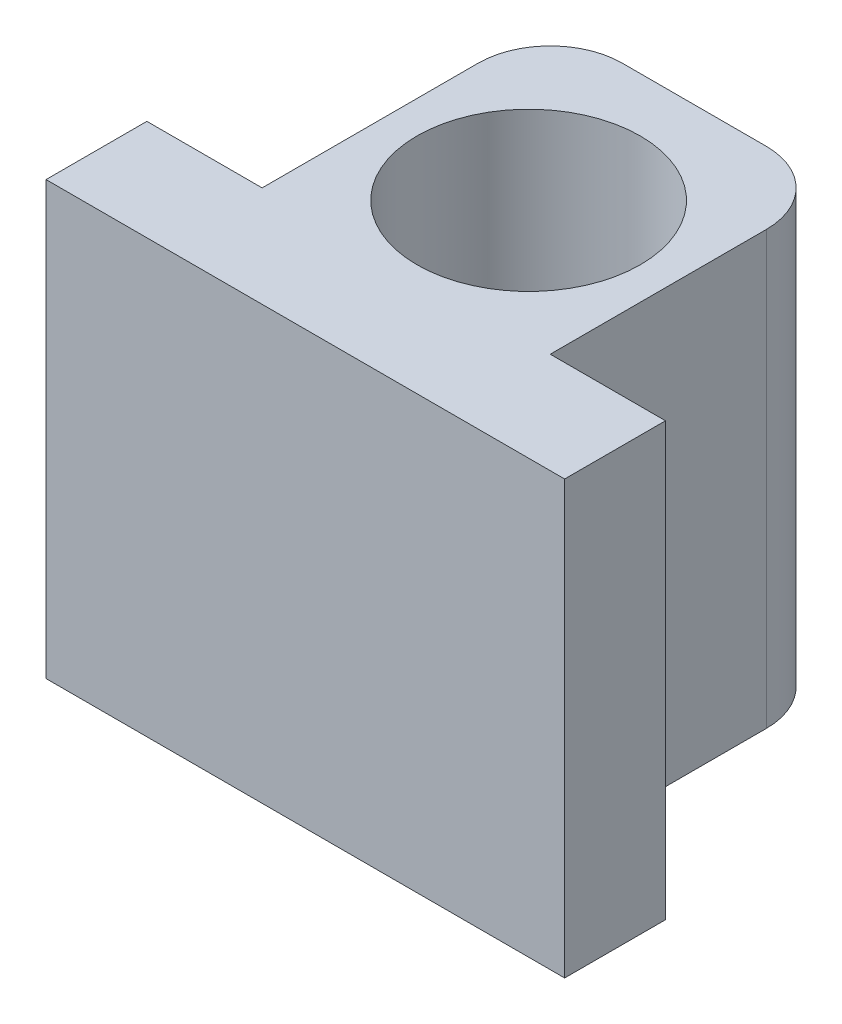
ISO-10303-21;
HEADER;
FILE_DESCRIPTION(('STEP AP214'),'2;1');
FILE_NAME('part.step','',(''),(''),'','','');
FILE_SCHEMA(('AUTOMOTIVE_DESIGN { 1 0 10303 214 1 1 1 1 }'));
ENDSEC;
DATA;
#1=APPLICATION_CONTEXT('core data for automotive mechanical design processes');
#2=APPLICATION_PROTOCOL_DEFINITION('international standard','automotive_design',2000,#1);
#3=PRODUCT_CONTEXT('',#1,'mechanical');
#4=PRODUCT('Part','Part','',(#3));
#5=PRODUCT_RELATED_PRODUCT_CATEGORY('part','',(#4));
#6=PRODUCT_DEFINITION_FORMATION('','',#4);
#7=PRODUCT_DEFINITION_CONTEXT('part definition',#1,'design');
#8=PRODUCT_DEFINITION('design','',#6,#7);
#9=PRODUCT_DEFINITION_SHAPE('','',#8);
#10=(LENGTH_UNIT() NAMED_UNIT(*) SI_UNIT(.MILLI.,.METRE.));
#11=(NAMED_UNIT(*) PLANE_ANGLE_UNIT() SI_UNIT($,.RADIAN.));
#12=(NAMED_UNIT(*) SI_UNIT($,.STERADIAN.) SOLID_ANGLE_UNIT());
#13=UNCERTAINTY_MEASURE_WITH_UNIT(LENGTH_MEASURE(1.E-05),#10,'distance_accuracy_value','');
#14=(GEOMETRIC_REPRESENTATION_CONTEXT(3) GLOBAL_UNCERTAINTY_ASSIGNED_CONTEXT((#13)) GLOBAL_UNIT_ASSIGNED_CONTEXT((#10,
#11,#12)) REPRESENTATION_CONTEXT('',''));
#15=CARTESIAN_POINT('',(0.,0.,0.));
#16=DIRECTION('',(0.,0.,1.));
#17=DIRECTION('',(1.,0.,0.));
#18=AXIS2_PLACEMENT_3D('',#15,#16,#17);
#19=CARTESIAN_POINT('',(-14.8639053254438,30.,3.));
#20=DIRECTION('',(1.,0.,0.));
#21=DIRECTION('',(0.,0.,-1.));
#22=AXIS2_PLACEMENT_3D('',#19,#20,#21);
#23=PLANE('',#22);
#24=DIRECTION('',(0.,0.,1.));
#25=VECTOR('',#24,1.);
#26=CARTESIAN_POINT('',(-14.8639053254438,0.,3.));
#27=LINE('',#26,#25);
#28=CARTESIAN_POINT('',(-14.8639053254438,0.,0.));
#29=VERTEX_POINT('',#28);
#30=CARTESIAN_POINT('',(-14.8639053254438,0.,7.));
#31=VERTEX_POINT('',#30);
#32=EDGE_CURVE('E125',#29,#31,#27,.T.);
#33=ORIENTED_EDGE('',*,*,#32,.T.);
#34=DIRECTION('',(0.,-1.,0.));
#35=VECTOR('',#34,1.);
#36=CARTESIAN_POINT('',(-14.8639053254438,30.,7.));
#37=LINE('',#36,#35);
#38=CARTESIAN_POINT('',(-14.8639053254438,30.,7.));
#39=VERTEX_POINT('',#38);
#40=EDGE_CURVE('E129',#39,#31,#37,.T.);
#41=ORIENTED_EDGE('',*,*,#40,.F.);
#42=DIRECTION('',(0.,0.,1.));
#43=VECTOR('',#42,1.);
#44=CARTESIAN_POINT('',(-14.8639053254438,30.,3.));
#45=LINE('',#44,#43);
#46=CARTESIAN_POINT('',(-14.8639053254438,30.,0.));
#47=VERTEX_POINT('',#46);
#48=EDGE_CURVE('E167',#47,#39,#45,.T.);
#49=ORIENTED_EDGE('',*,*,#48,.F.);
#50=DIRECTION('',(0.,-1.,0.));
#51=VECTOR('',#50,1.);
#52=CARTESIAN_POINT('',(-14.8639053254438,30.,0.));
#53=LINE('',#52,#51);
#54=EDGE_CURVE('E131',#47,#29,#53,.T.);
#55=ORIENTED_EDGE('',*,*,#54,.T.);
#56=EDGE_LOOP('',(#33,#41,#49,#55));
#57=FACE_BOUND('',#56,.T.);
#58=ADVANCED_FACE('F43',(#57),#23,.F.);
#59=CARTESIAN_POINT('',(21.1360946745562,30.,0.));
#60=DIRECTION('',(-1.,0.,0.));
#61=DIRECTION('',(0.,0.,1.));
#62=AXIS2_PLACEMENT_3D('',#59,#60,#61);
#63=PLANE('',#62);
#64=DIRECTION('',(0.,0.,-1.));
#65=VECTOR('',#64,1.);
#66=CARTESIAN_POINT('',(21.1360946745562,0.,0.));
#67=LINE('',#66,#65);
#68=CARTESIAN_POINT('',(21.1360946745562,0.,7.));
#69=VERTEX_POINT('',#68);
#70=CARTESIAN_POINT('',(21.1360946745562,0.,0.));
#71=VERTEX_POINT('',#70);
#72=EDGE_CURVE('E135',#69,#71,#67,.T.);
#73=ORIENTED_EDGE('',*,*,#72,.T.);
#74=DIRECTION('',(0.,-1.,0.));
#75=VECTOR('',#74,1.);
#76=CARTESIAN_POINT('',(21.1360946745562,30.,0.));
#77=LINE('',#76,#75);
#78=CARTESIAN_POINT('',(21.1360946745562,30.,0.));
#79=VERTEX_POINT('',#78);
#80=EDGE_CURVE('E216',#79,#71,#77,.T.);
#81=ORIENTED_EDGE('',*,*,#80,.F.);
#82=DIRECTION('',(0.,0.,-1.));
#83=VECTOR('',#82,1.);
#84=CARTESIAN_POINT('',(21.1360946745562,30.,0.));
#85=LINE('',#84,#83);
#86=CARTESIAN_POINT('',(21.1360946745562,30.,7.));
#87=VERTEX_POINT('',#86);
#88=EDGE_CURVE('E170',#87,#79,#85,.T.);
#89=ORIENTED_EDGE('',*,*,#88,.F.);
#90=DIRECTION('',(0.,1.,0.));
#91=VECTOR('',#90,1.);
#92=CARTESIAN_POINT('',(21.1360946745562,30.,7.));
#93=LINE('',#92,#91);
#94=EDGE_CURVE('E147',#69,#87,#93,.T.);
#95=ORIENTED_EDGE('',*,*,#94,.F.);
#96=EDGE_LOOP('',(#73,#81,#89,#95));
#97=FACE_BOUND('',#96,.T.);
#98=ADVANCED_FACE('F254',(#97),#63,.F.);
#99=CARTESIAN_POINT('',(13.1360946745562,30.,0.));
#100=DIRECTION('',(0.,0.,1.));
#101=DIRECTION('',(1.,0.,0.));
#102=AXIS2_PLACEMENT_3D('',#99,#100,#101);
#103=PLANE('',#102);
#104=DIRECTION('',(-1.,0.,0.));
#105=VECTOR('',#104,1.);
#106=CARTESIAN_POINT('',(13.1360946745562,0.,0.));
#107=LINE('',#106,#105);
#108=CARTESIAN_POINT('',(13.1360946745562,0.,0.));
#109=VERTEX_POINT('',#108);
#110=EDGE_CURVE('E191',#71,#109,#107,.T.);
#111=ORIENTED_EDGE('',*,*,#110,.T.);
#112=DIRECTION('',(0.,-1.,0.));
#113=VECTOR('',#112,1.);
#114=CARTESIAN_POINT('',(13.1360946745562,30.,0.));
#115=LINE('',#114,#113);
#116=CARTESIAN_POINT('',(13.1360946745562,30.,0.));
#117=VERTEX_POINT('',#116);
#118=EDGE_CURVE('E212',#117,#109,#115,.T.);
#119=ORIENTED_EDGE('',*,*,#118,.F.);
#120=DIRECTION('',(-1.,0.,0.));
#121=VECTOR('',#120,1.);
#122=CARTESIAN_POINT('',(13.1360946745562,30.,0.));
#123=LINE('',#122,#121);
#124=EDGE_CURVE('E174',#79,#117,#123,.T.);
#125=ORIENTED_EDGE('',*,*,#124,.F.);
#126=ORIENTED_EDGE('',*,*,#80,.T.);
#127=EDGE_LOOP('',(#111,#119,#125,#126));
#128=FACE_BOUND('',#127,.T.);
#129=ADVANCED_FACE('F251',(#128),#103,.F.);
#130=CARTESIAN_POINT('',(13.1360946745562,30.,-20.));
#131=DIRECTION('',(-1.,0.,0.));
#132=DIRECTION('',(0.,0.,1.));
#133=AXIS2_PLACEMENT_3D('',#130,#131,#132);
#134=PLANE('',#133);
#135=DIRECTION('',(0.,0.,-1.));
#136=VECTOR('',#135,1.);
#137=CARTESIAN_POINT('',(13.1360946745562,0.,-20.));
#138=LINE('',#137,#136);
#139=CARTESIAN_POINT('',(13.1360946745562,0.,-15.));
#140=VERTEX_POINT('',#139);
#141=EDGE_CURVE('E194',#109,#140,#138,.T.);
#142=ORIENTED_EDGE('',*,*,#141,.T.);
#143=DIRECTION('',(0.,-1.,0.));
#144=VECTOR('',#143,1.);
#145=CARTESIAN_POINT('',(13.1360946745562,30.,-15.));
#146=LINE('',#145,#144);
#147=CARTESIAN_POINT('',(13.1360946745562,30.,-15.));
#148=VERTEX_POINT('',#147);
#149=EDGE_CURVE('E67',#140,#148,#146,.F.);
#150=ORIENTED_EDGE('',*,*,#149,.T.);
#151=DIRECTION('',(0.,0.,-1.));
#152=VECTOR('',#151,1.);
#153=CARTESIAN_POINT('',(13.1360946745562,30.,-20.));
#154=LINE('',#153,#152);
#155=EDGE_CURVE('E177',#117,#148,#154,.T.);
#156=ORIENTED_EDGE('',*,*,#155,.F.);
#157=ORIENTED_EDGE('',*,*,#118,.T.);
#158=EDGE_LOOP('',(#142,#150,#156,#157));
#159=FACE_BOUND('',#158,.T.);
#160=ADVANCED_FACE('F247',(#159),#134,.F.);
#161=CARTESIAN_POINT('',(-6.86390532544379,30.,-20.));
#162=DIRECTION('',(0.,0.,1.));
#163=DIRECTION('',(1.,0.,0.));
#164=AXIS2_PLACEMENT_3D('',#161,#162,#163);
#165=PLANE('',#164);
#166=DIRECTION('',(-1.,0.,0.));
#167=VECTOR('',#166,1.);
#168=CARTESIAN_POINT('',(-6.86390532544379,30.,-20.));
#169=LINE('',#168,#167);
#170=CARTESIAN_POINT('',(8.13609467455621,30.,-20.));
#171=VERTEX_POINT('',#170);
#172=CARTESIAN_POINT('',(-1.86390532544379,30.,-20.));
#173=VERTEX_POINT('',#172);
#174=EDGE_CURVE('E180',#171,#173,#169,.T.);
#175=ORIENTED_EDGE('',*,*,#174,.F.);
#176=DIRECTION('',(0.,-1.,0.));
#177=VECTOR('',#176,1.);
#178=CARTESIAN_POINT('',(8.13609467455621,30.,-20.));
#179=LINE('',#178,#177);
#180=CARTESIAN_POINT('',(8.13609467455621,0.,-20.));
#181=VERTEX_POINT('',#180);
#182=EDGE_CURVE('E223',#171,#181,#179,.T.);
#183=ORIENTED_EDGE('',*,*,#182,.T.);
#184=DIRECTION('',(-1.,0.,0.));
#185=VECTOR('',#184,1.);
#186=CARTESIAN_POINT('',(-6.86390532544379,0.,-20.));
#187=LINE('',#186,#185);
#188=CARTESIAN_POINT('',(-1.86390532544379,0.,-20.));
#189=VERTEX_POINT('',#188);
#190=EDGE_CURVE('E197',#181,#189,#187,.T.);
#191=ORIENTED_EDGE('',*,*,#190,.T.);
#192=DIRECTION('',(0.,-1.,0.));
#193=VECTOR('',#192,1.);
#194=CARTESIAN_POINT('',(-1.86390532544379,30.,-20.));
#195=LINE('',#194,#193);
#196=EDGE_CURVE('E220',#189,#173,#195,.F.);
#197=ORIENTED_EDGE('',*,*,#196,.T.);
#198=EDGE_LOOP('',(#175,#183,#191,#197));
#199=FACE_BOUND('',#198,.T.);
#200=ADVANCED_FACE('F243',(#199),#165,.F.);
#201=CARTESIAN_POINT('',(-6.86390532544379,30.,0.));
#202=DIRECTION('',(1.,0.,0.));
#203=DIRECTION('',(0.,0.,-1.));
#204=AXIS2_PLACEMENT_3D('',#201,#202,#203);
#205=PLANE('',#204);
#206=DIRECTION('',(0.,0.,1.));
#207=VECTOR('',#206,1.);
#208=CARTESIAN_POINT('',(-6.86390532544379,30.,0.));
#209=LINE('',#208,#207);
#210=CARTESIAN_POINT('',(-6.86390532544379,30.,-15.));
#211=VERTEX_POINT('',#210);
#212=CARTESIAN_POINT('',(-6.86390532544379,30.,0.));
#213=VERTEX_POINT('',#212);
#214=EDGE_CURVE('E183',#211,#213,#209,.T.);
#215=ORIENTED_EDGE('',*,*,#214,.F.);
#216=DIRECTION('',(0.,-1.,0.));
#217=VECTOR('',#216,1.);
#218=CARTESIAN_POINT('',(-6.86390532544379,30.,-15.));
#219=LINE('',#218,#217);
#220=CARTESIAN_POINT('',(-6.86390532544379,0.,-15.));
#221=VERTEX_POINT('',#220);
#222=EDGE_CURVE('E11',#211,#221,#219,.T.);
#223=ORIENTED_EDGE('',*,*,#222,.T.);
#224=DIRECTION('',(0.,0.,1.));
#225=VECTOR('',#224,1.);
#226=CARTESIAN_POINT('',(-6.86390532544379,0.,0.));
#227=LINE('',#226,#225);
#228=CARTESIAN_POINT('',(-6.86390532544379,0.,0.));
#229=VERTEX_POINT('',#228);
#230=EDGE_CURVE('E201',#221,#229,#227,.T.);
#231=ORIENTED_EDGE('',*,*,#230,.T.);
#232=DIRECTION('',(0.,-1.,0.));
#233=VECTOR('',#232,1.);
#234=CARTESIAN_POINT('',(-6.86390532544379,30.,0.));
#235=LINE('',#234,#233);
#236=EDGE_CURVE('E208',#213,#229,#235,.T.);
#237=ORIENTED_EDGE('',*,*,#236,.F.);
#238=EDGE_LOOP('',(#215,#223,#231,#237));
#239=FACE_BOUND('',#238,.T.);
#240=ADVANCED_FACE('F261',(#239),#205,.F.);
#241=CARTESIAN_POINT('',(-14.8639053254438,30.,0.));
#242=DIRECTION('',(0.,0.,1.));
#243=DIRECTION('',(1.,0.,0.));
#244=AXIS2_PLACEMENT_3D('',#241,#242,#243);
#245=PLANE('',#244);
#246=DIRECTION('',(-1.,0.,0.));
#247=VECTOR('',#246,1.);
#248=CARTESIAN_POINT('',(-14.8639053254438,0.,0.));
#249=LINE('',#248,#247);
#250=EDGE_CURVE('E171',#229,#29,#249,.T.);
#251=ORIENTED_EDGE('',*,*,#250,.T.);
#252=ORIENTED_EDGE('',*,*,#54,.F.);
#253=DIRECTION('',(-1.,0.,0.));
#254=VECTOR('',#253,1.);
#255=CARTESIAN_POINT('',(-14.8639053254438,30.,0.));
#256=LINE('',#255,#254);
#257=EDGE_CURVE('E186',#213,#47,#256,.T.);
#258=ORIENTED_EDGE('',*,*,#257,.F.);
#259=ORIENTED_EDGE('',*,*,#236,.T.);
#260=EDGE_LOOP('',(#251,#252,#258,#259));
#261=FACE_BOUND('',#260,.T.);
#262=ADVANCED_FACE('F258',(#261),#245,.F.);
#263=CARTESIAN_POINT('',(0.,30.,0.));
#264=DIRECTION('',(0.,-1.,0.));
#265=DIRECTION('',(0.,0.,-1.));
#266=AXIS2_PLACEMENT_3D('',#263,#264,#265);
#267=PLANE('',#266);
#268=CARTESIAN_POINT('',(3.13609467455622,30.,-8.49999999999999));
#269=DIRECTION('',(0.,-1.,0.));
#270=DIRECTION('',(0.,0.,-1.));
#271=AXIS2_PLACEMENT_3D('',#268,#269,#270);
#272=CIRCLE('',#271,7.75);
#273=CARTESIAN_POINT('',(3.13609467455622,30.,-16.25));
#274=VERTEX_POINT('',#273);
#275=EDGE_CURVE('E136',#274,#274,#272,.T.);
#276=ORIENTED_EDGE('',*,*,#275,.T.);
#277=EDGE_LOOP('',(#276));
#278=FACE_BOUND('',#277,.T.);
#279=ORIENTED_EDGE('',*,*,#155,.T.);
#280=CARTESIAN_POINT('',(8.13609467455621,30.,-15.));
#281=DIRECTION('',(0.,-1.,0.));
#282=DIRECTION('',(0.,0.,-1.));
#283=AXIS2_PLACEMENT_3D('',#280,#281,#282);
#284=CIRCLE('',#283,5.);
#285=EDGE_CURVE('E52',#148,#171,#284,.F.);
#286=ORIENTED_EDGE('',*,*,#285,.T.);
#287=ORIENTED_EDGE('',*,*,#174,.T.);
#288=CARTESIAN_POINT('',(-1.86390532544379,30.,-15.));
#289=DIRECTION('',(0.,-1.,0.));
#290=DIRECTION('',(0.,0.,-1.));
#291=AXIS2_PLACEMENT_3D('',#288,#289,#290);
#292=CIRCLE('',#291,5.);
#293=EDGE_CURVE('E59',#173,#211,#292,.F.);
#294=ORIENTED_EDGE('',*,*,#293,.T.);
#295=ORIENTED_EDGE('',*,*,#214,.T.);
#296=ORIENTED_EDGE('',*,*,#257,.T.);
#297=ORIENTED_EDGE('',*,*,#48,.T.);
#298=DIRECTION('',(-1.,0.,0.));
#299=VECTOR('',#298,1.);
#300=CARTESIAN_POINT('',(-14.8639053254438,30.,7.));
#301=LINE('',#300,#299);
#302=EDGE_CURVE('E152',#87,#39,#301,.T.);
#303=ORIENTED_EDGE('',*,*,#302,.F.);
#304=ORIENTED_EDGE('',*,*,#88,.T.);
#305=ORIENTED_EDGE('',*,*,#124,.T.);
#306=EDGE_LOOP('',(#279,#286,#287,#294,#295,#296,#297,#303,#304,#305));
#307=FACE_BOUND('',#306,.T.);
#308=ADVANCED_FACE('F239',(#278,#307),#267,.F.);
#309=CARTESIAN_POINT('',(0.,0.,0.));
#310=DIRECTION('',(0.,-1.,0.));
#311=DIRECTION('',(0.,0.,-1.));
#312=AXIS2_PLACEMENT_3D('',#309,#310,#311);
#313=PLANE('',#312);
#314=CARTESIAN_POINT('',(3.13609467455622,0.,-8.49999999999999));
#315=DIRECTION('',(0.,-1.,0.));
#316=DIRECTION('',(0.,0.,-1.));
#317=AXIS2_PLACEMENT_3D('',#314,#315,#316);
#318=CIRCLE('',#317,7.75);
#319=CARTESIAN_POINT('',(3.13609467455622,0.,-16.25));
#320=VERTEX_POINT('',#319);
#321=EDGE_CURVE('E160',#320,#320,#318,.T.);
#322=ORIENTED_EDGE('',*,*,#321,.F.);
#323=EDGE_LOOP('',(#322));
#324=FACE_BOUND('',#323,.T.);
#325=ORIENTED_EDGE('',*,*,#190,.F.);
#326=CARTESIAN_POINT('',(8.13609467455621,0.,-15.));
#327=DIRECTION('',(0.,-1.,0.));
#328=DIRECTION('',(0.,0.,-1.));
#329=AXIS2_PLACEMENT_3D('',#326,#327,#328);
#330=CIRCLE('',#329,5.);
#331=EDGE_CURVE('E230',#181,#140,#330,.T.);
#332=ORIENTED_EDGE('',*,*,#331,.T.);
#333=ORIENTED_EDGE('',*,*,#141,.F.);
#334=ORIENTED_EDGE('',*,*,#110,.F.);
#335=ORIENTED_EDGE('',*,*,#72,.F.);
#336=DIRECTION('',(1.,0.,0.));
#337=VECTOR('',#336,1.);
#338=CARTESIAN_POINT('',(-14.8639053254438,0.,7.));
#339=LINE('',#338,#337);
#340=EDGE_CURVE('E139',#31,#69,#339,.T.);
#341=ORIENTED_EDGE('',*,*,#340,.F.);
#342=ORIENTED_EDGE('',*,*,#32,.F.);
#343=ORIENTED_EDGE('',*,*,#250,.F.);
#344=ORIENTED_EDGE('',*,*,#230,.F.);
#345=CARTESIAN_POINT('',(-1.86390532544379,0.,-15.));
#346=DIRECTION('',(0.,-1.,0.));
#347=DIRECTION('',(0.,0.,-1.));
#348=AXIS2_PLACEMENT_3D('',#345,#346,#347);
#349=CIRCLE('',#348,5.);
#350=EDGE_CURVE('E227',#221,#189,#349,.T.);
#351=ORIENTED_EDGE('',*,*,#350,.T.);
#352=EDGE_LOOP('',(#325,#332,#333,#334,#335,#341,#342,#343,#344,#351));
#353=FACE_BOUND('',#352,.T.);
#354=ADVANCED_FACE('F141',(#324,#353),#313,.T.);
#355=CARTESIAN_POINT('',(3.13609467455622,30.,-8.49999999999999));
#356=DIRECTION('',(0.,-1.,0.));
#357=DIRECTION('',(0.,0.,-1.));
#358=AXIS2_PLACEMENT_3D('',#355,#356,#357);
#359=CYLINDRICAL_SURFACE('',#358,7.75);
#360=ORIENTED_EDGE('',*,*,#275,.F.);
#361=EDGE_LOOP('',(#360));
#362=FACE_BOUND('',#361,.T.);
#363=ORIENTED_EDGE('',*,*,#321,.T.);
#364=EDGE_LOOP('',(#363));
#365=FACE_BOUND('',#364,.T.);
#366=ADVANCED_FACE('F271',(#362,#365),#359,.F.);
#367=CARTESIAN_POINT('',(8.13609467455621,30.,-15.));
#368=DIRECTION('',(0.,-1.,0.));
#369=DIRECTION('',(0.,0.,-1.));
#370=AXIS2_PLACEMENT_3D('',#367,#368,#369);
#371=CYLINDRICAL_SURFACE('',#370,5.);
#372=ORIENTED_EDGE('',*,*,#285,.F.);
#373=ORIENTED_EDGE('',*,*,#149,.F.);
#374=ORIENTED_EDGE('',*,*,#331,.F.);
#375=ORIENTED_EDGE('',*,*,#182,.F.);
#376=EDGE_LOOP('',(#372,#373,#374,#375));
#377=FACE_BOUND('',#376,.T.);
#378=ADVANCED_FACE('F245',(#377),#371,.T.);
#379=CARTESIAN_POINT('',(-1.86390532544379,30.,-15.));
#380=DIRECTION('',(0.,-1.,0.));
#381=DIRECTION('',(0.,0.,-1.));
#382=AXIS2_PLACEMENT_3D('',#379,#380,#381);
#383=CYLINDRICAL_SURFACE('',#382,5.);
#384=ORIENTED_EDGE('',*,*,#293,.F.);
#385=ORIENTED_EDGE('',*,*,#196,.F.);
#386=ORIENTED_EDGE('',*,*,#350,.F.);
#387=ORIENTED_EDGE('',*,*,#222,.F.);
#388=EDGE_LOOP('',(#384,#385,#386,#387));
#389=FACE_BOUND('',#388,.T.);
#390=ADVANCED_FACE('F45',(#389),#383,.T.);
#391=CARTESIAN_POINT('',(0.,0.,7.));
#392=DIRECTION('',(0.,0.,1.));
#393=DIRECTION('',(1.,0.,0.));
#394=AXIS2_PLACEMENT_3D('',#391,#392,#393);
#395=PLANE('',#394);
#396=ORIENTED_EDGE('',*,*,#40,.T.);
#397=ORIENTED_EDGE('',*,*,#340,.T.);
#398=ORIENTED_EDGE('',*,*,#94,.T.);
#399=ORIENTED_EDGE('',*,*,#302,.T.);
#400=EDGE_LOOP('',(#396,#397,#398,#399));
#401=FACE_BOUND('',#400,.T.);
#402=ADVANCED_FACE('F150',(#401),#395,.T.);
#403=CLOSED_SHELL('',(#58,#98,#129,#160,#200,#240,#262,#308,#354,#366,#378,#390,#402));
#404=MANIFOLD_SOLID_BREP('B2',#403);
#405=ADVANCED_BREP_SHAPE_REPRESENTATION('',(#18,#404),#14);
#406=SHAPE_DEFINITION_REPRESENTATION(#9,#405);
ENDSEC;
END-ISO-10303-21;
